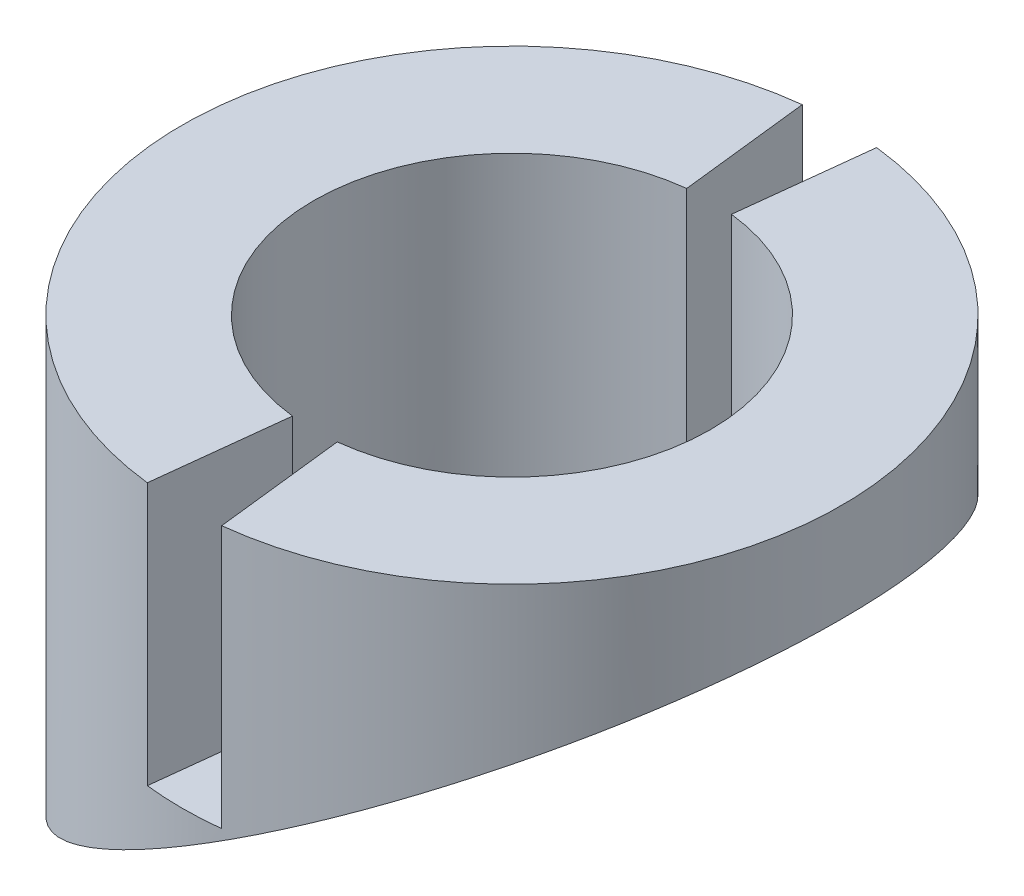
ISO-10303-21;
HEADER;
FILE_DESCRIPTION(('STEP AP214'),'2;1');
FILE_NAME('part.step','',(''),(''),'','','');
FILE_SCHEMA(('AUTOMOTIVE_DESIGN { 1 0 10303 214 1 1 1 1 }'));
ENDSEC;
DATA;
#1=APPLICATION_CONTEXT('core data for automotive mechanical design processes');
#2=APPLICATION_PROTOCOL_DEFINITION('international standard','automotive_design',2000,#1);
#3=PRODUCT_CONTEXT('',#1,'mechanical');
#4=PRODUCT('Part','Part','',(#3));
#5=PRODUCT_RELATED_PRODUCT_CATEGORY('part','',(#4));
#6=PRODUCT_DEFINITION_FORMATION('','',#4);
#7=PRODUCT_DEFINITION_CONTEXT('part definition',#1,'design');
#8=PRODUCT_DEFINITION('design','',#6,#7);
#9=PRODUCT_DEFINITION_SHAPE('','',#8);
#10=(LENGTH_UNIT() NAMED_UNIT(*) SI_UNIT(.MILLI.,.METRE.));
#11=(NAMED_UNIT(*) PLANE_ANGLE_UNIT() SI_UNIT($,.RADIAN.));
#12=(NAMED_UNIT(*) SI_UNIT($,.STERADIAN.) SOLID_ANGLE_UNIT());
#13=UNCERTAINTY_MEASURE_WITH_UNIT(LENGTH_MEASURE(1.E-05),#10,'distance_accuracy_value','');
#14=(GEOMETRIC_REPRESENTATION_CONTEXT(3) GLOBAL_UNCERTAINTY_ASSIGNED_CONTEXT((#13)) GLOBAL_UNIT_ASSIGNED_CONTEXT((#10,
#11,#12)) REPRESENTATION_CONTEXT('',''));
#15=CARTESIAN_POINT('',(0.,0.,0.));
#16=DIRECTION('',(0.,0.,1.));
#17=DIRECTION('',(1.,0.,0.));
#18=AXIS2_PLACEMENT_3D('',#15,#16,#17);
#19=CARTESIAN_POINT('',(0.,15.,0.));
#20=DIRECTION('',(0.,1.,0.));
#21=DIRECTION('',(0.,0.,1.));
#22=AXIS2_PLACEMENT_3D('',#19,#20,#21);
#23=PLANE('',#22);
#24=DIRECTION('',(0.112854640488553,0.,-0.99361150864923));
#25=VECTOR('',#24,1.);
#26=CARTESIAN_POINT('',(0.637272671467664,15.,-5.61077025966101));
#27=LINE('',#26,#25);
#28=CARTESIAN_POINT('',(0.682770574955748,15.,-6.01134962732784));
#29=VERTEX_POINT('',#28);
#30=CARTESIAN_POINT('',(1.13418913690996,15.,-9.98579566192476));
#31=VERTEX_POINT('',#30);
#32=EDGE_CURVE('E178',#29,#31,#27,.T.);
#33=ORIENTED_EDGE('',*,*,#32,.F.);
#34=CARTESIAN_POINT('',(0.,15.,0.));
#35=DIRECTION('',(0.,1.,0.));
#36=DIRECTION('',(0.,0.,1.));
#37=AXIS2_PLACEMENT_3D('',#34,#35,#36);
#38=CIRCLE('',#37,6.05);
#39=CARTESIAN_POINT('',(0.682770574955748,15.,6.01134962732784));
#40=VERTEX_POINT('',#39);
#41=EDGE_CURVE('E137',#40,#29,#38,.T.);
#42=ORIENTED_EDGE('',*,*,#41,.F.);
#43=DIRECTION('',(-0.112854640488553,0.,-0.99361150864923));
#44=VECTOR('',#43,1.);
#45=CARTESIAN_POINT('',(0.637272671467664,15.,5.61077025966101));
#46=LINE('',#45,#44);
#47=CARTESIAN_POINT('',(1.13418913690996,15.,9.98579566192476));
#48=VERTEX_POINT('',#47);
#49=EDGE_CURVE('E129',#48,#40,#46,.T.);
#50=ORIENTED_EDGE('',*,*,#49,.F.);
#51=CARTESIAN_POINT('',(0.,15.,0.));
#52=DIRECTION('',(0.,1.,0.));
#53=DIRECTION('',(0.,0.,1.));
#54=AXIS2_PLACEMENT_3D('',#51,#52,#53);
#55=CIRCLE('',#54,10.05);
#56=EDGE_CURVE('E148',#48,#31,#55,.T.);
#57=ORIENTED_EDGE('',*,*,#56,.T.);
#58=EDGE_LOOP('',(#33,#42,#50,#57));
#59=FACE_BOUND('',#58,.T.);
#60=ADVANCED_FACE('F40',(#59),#23,.T.);
#61=DIRECTION('',(0.112854640488553,0.,0.99361150864923));
#62=VECTOR('',#61,1.);
#63=CARTESIAN_POINT('',(-0.637272671467664,15.,-5.61077025966101));
#64=LINE('',#63,#62);
#65=CARTESIAN_POINT('',(-1.13418913690996,15.,-9.98579566192476));
#66=VERTEX_POINT('',#65);
#67=CARTESIAN_POINT('',(-0.682770574955748,15.,-6.01134962732784));
#68=VERTEX_POINT('',#67);
#69=EDGE_CURVE('E163',#66,#68,#64,.T.);
#70=ORIENTED_EDGE('',*,*,#69,.F.);
#71=CARTESIAN_POINT('',(-1.13418913690996,15.,9.98579566192476));
#72=VERTEX_POINT('',#71);
#73=EDGE_CURVE('E127',#66,#72,#55,.T.);
#74=ORIENTED_EDGE('',*,*,#73,.T.);
#75=DIRECTION('',(-0.112854640488553,0.,0.99361150864923));
#76=VECTOR('',#75,1.);
#77=CARTESIAN_POINT('',(-0.637272671467664,15.,5.61077025966101));
#78=LINE('',#77,#76);
#79=CARTESIAN_POINT('',(-0.682770574955748,15.,6.01134962732784));
#80=VERTEX_POINT('',#79);
#81=EDGE_CURVE('E109',#80,#72,#78,.T.);
#82=ORIENTED_EDGE('',*,*,#81,.F.);
#83=EDGE_CURVE('E125',#68,#80,#38,.T.);
#84=ORIENTED_EDGE('',*,*,#83,.F.);
#85=EDGE_LOOP('',(#70,#74,#82,#84));
#86=FACE_BOUND('',#85,.T.);
#87=ADVANCED_FACE('F124',(#86),#23,.T.);
#88=CARTESIAN_POINT('',(0.,15.,0.));
#89=DIRECTION('',(0.,-1.,0.));
#90=DIRECTION('',(0.,0.,-1.));
#91=AXIS2_PLACEMENT_3D('',#88,#89,#90);
#92=CYLINDRICAL_SURFACE('',#91,10.05);
#93=CARTESIAN_POINT('',(0.,7.,0.));
#94=DIRECTION('',(0.,1.,0.));
#95=DIRECTION('',(0.,0.,1.));
#96=AXIS2_PLACEMENT_3D('',#93,#94,#95);
#97=CIRCLE('',#96,10.05);
#98=CARTESIAN_POINT('',(1.13418913690996,7.,-9.98579566192476));
#99=VERTEX_POINT('',#98);
#100=CARTESIAN_POINT('',(-1.13418913690996,7.,-9.98579566192476));
#101=VERTEX_POINT('',#100);
#102=EDGE_CURVE('E200',#99,#101,#97,.T.);
#103=ORIENTED_EDGE('',*,*,#102,.F.);
#104=DIRECTION('',(0.,-1.,0.));
#105=VECTOR('',#104,1.);
#106=CARTESIAN_POINT('',(1.13418913690996,15.,-9.98579566192476));
#107=LINE('',#106,#105);
#108=EDGE_CURVE('E138',#99,#31,#107,.F.);
#109=ORIENTED_EDGE('',*,*,#108,.T.);
#110=ORIENTED_EDGE('',*,*,#56,.F.);
#111=DIRECTION('',(0.,-1.,0.));
#112=VECTOR('',#111,1.);
#113=CARTESIAN_POINT('',(1.13418913690996,15.,9.98579566192476));
#114=LINE('',#113,#112);
#115=CARTESIAN_POINT('',(1.13418913690996,7.,9.98579566192476));
#116=VERTEX_POINT('',#115);
#117=EDGE_CURVE('E196',#48,#116,#114,.T.);
#118=ORIENTED_EDGE('',*,*,#117,.T.);
#119=CARTESIAN_POINT('',(0.,7.,0.));
#120=DIRECTION('',(0.,-1.,0.));
#121=DIRECTION('',(0.,0.,-1.));
#122=AXIS2_PLACEMENT_3D('',#119,#120,#121);
#123=CIRCLE('',#122,10.05);
#124=CARTESIAN_POINT('',(-1.13418913690996,7.,9.98579566192476));
#125=VERTEX_POINT('',#124);
#126=EDGE_CURVE('E176',#116,#125,#123,.T.);
#127=ORIENTED_EDGE('',*,*,#126,.T.);
#128=DIRECTION('',(0.,-1.,0.));
#129=VECTOR('',#128,1.);
#130=CARTESIAN_POINT('',(-1.13418913690996,15.,9.98579566192476));
#131=LINE('',#130,#129);
#132=EDGE_CURVE('E193',#125,#72,#131,.F.);
#133=ORIENTED_EDGE('',*,*,#132,.T.);
#134=ORIENTED_EDGE('',*,*,#73,.F.);
#135=DIRECTION('',(0.,-1.,0.));
#136=VECTOR('',#135,1.);
#137=CARTESIAN_POINT('',(-1.13418913690996,15.,-9.98579566192476));
#138=LINE('',#137,#136);
#139=EDGE_CURVE('E144',#66,#101,#138,.T.);
#140=ORIENTED_EDGE('',*,*,#139,.T.);
#141=EDGE_LOOP('',(#103,#109,#110,#118,#127,#133,#134,#140));
#142=FACE_BOUND('',#141,.T.);
#143=CARTESIAN_POINT('',(0.,6.,0.));
#144=DIRECTION('',(-0.512609917553606,0.858621611902289,0.));
#145=DIRECTION('',(-0.858621611902289,-0.512609917553606,0.));
#146=AXIS2_PLACEMENT_3D('',#143,#144,#145);
#147=ELLIPSE('',#146,11.7048067049396,10.05);
#148=CARTESIAN_POINT('',(-10.05,0.,0.));
#149=VERTEX_POINT('',#148);
#150=EDGE_CURVE('E130',#149,#149,#147,.T.);
#151=ORIENTED_EDGE('',*,*,#150,.T.);
#152=EDGE_LOOP('',(#151));
#153=FACE_BOUND('',#152,.T.);
#154=ADVANCED_FACE('F42',(#142,#153),#92,.T.);
#155=CARTESIAN_POINT('',(0.,15.,0.));
#156=DIRECTION('',(0.,-1.,0.));
#157=DIRECTION('',(0.,0.,-1.));
#158=AXIS2_PLACEMENT_3D('',#155,#156,#157);
#159=CYLINDRICAL_SURFACE('',#158,6.05);
#160=CARTESIAN_POINT('',(0.,6.,0.));
#161=DIRECTION('',(-0.512609917553606,0.858621611902289,0.));
#162=DIRECTION('',(-0.858621611902289,-0.512609917553606,0.));
#163=AXIS2_PLACEMENT_3D('',#160,#161,#162);
#164=ELLIPSE('',#163,7.04617717063531,6.05);
#165=CARTESIAN_POINT('',(-6.05,2.38805970149254,0.));
#166=VERTEX_POINT('',#165);
#167=EDGE_CURVE('E44',#166,#166,#164,.T.);
#168=ORIENTED_EDGE('',*,*,#167,.F.);
#169=EDGE_LOOP('',(#168));
#170=FACE_BOUND('',#169,.T.);
#171=DIRECTION('',(0.,-1.,0.));
#172=VECTOR('',#171,1.);
#173=CARTESIAN_POINT('',(0.682770574955748,15.,-6.01134962732784));
#174=LINE('',#173,#172);
#175=CARTESIAN_POINT('',(0.682770574955748,7.,-6.01134962732784));
#176=VERTEX_POINT('',#175);
#177=EDGE_CURVE('E11',#176,#29,#174,.F.);
#178=ORIENTED_EDGE('',*,*,#177,.F.);
#179=CARTESIAN_POINT('',(0.,7.,0.));
#180=DIRECTION('',(0.,1.,0.));
#181=DIRECTION('',(0.,0.,1.));
#182=AXIS2_PLACEMENT_3D('',#179,#180,#181);
#183=CIRCLE('',#182,6.05);
#184=CARTESIAN_POINT('',(-0.682770574955748,7.,-6.01134962732784));
#185=VERTEX_POINT('',#184);
#186=EDGE_CURVE('E156',#176,#185,#183,.T.);
#187=ORIENTED_EDGE('',*,*,#186,.T.);
#188=DIRECTION('',(0.,-1.,0.));
#189=VECTOR('',#188,1.);
#190=CARTESIAN_POINT('',(-0.682770574955748,15.,-6.01134962732784));
#191=LINE('',#190,#189);
#192=EDGE_CURVE('E50',#68,#185,#191,.T.);
#193=ORIENTED_EDGE('',*,*,#192,.F.);
#194=ORIENTED_EDGE('',*,*,#83,.T.);
#195=DIRECTION('',(0.,-1.,0.));
#196=VECTOR('',#195,1.);
#197=CARTESIAN_POINT('',(-0.682770574955748,15.,6.01134962732784));
#198=LINE('',#197,#196);
#199=CARTESIAN_POINT('',(-0.682770574955748,7.,6.01134962732784));
#200=VERTEX_POINT('',#199);
#201=EDGE_CURVE('E106',#200,#80,#198,.F.);
#202=ORIENTED_EDGE('',*,*,#201,.F.);
#203=CARTESIAN_POINT('',(0.,7.,0.));
#204=DIRECTION('',(0.,-1.,0.));
#205=DIRECTION('',(0.,0.,-1.));
#206=AXIS2_PLACEMENT_3D('',#203,#204,#205);
#207=CIRCLE('',#206,6.05);
#208=CARTESIAN_POINT('',(0.682770574955748,7.,6.01134962732784));
#209=VERTEX_POINT('',#208);
#210=EDGE_CURVE('E118',#209,#200,#207,.T.);
#211=ORIENTED_EDGE('',*,*,#210,.F.);
#212=DIRECTION('',(0.,-1.,0.));
#213=VECTOR('',#212,1.);
#214=CARTESIAN_POINT('',(0.682770574955748,15.,6.01134962732784));
#215=LINE('',#214,#213);
#216=EDGE_CURVE('E117',#40,#209,#215,.T.);
#217=ORIENTED_EDGE('',*,*,#216,.F.);
#218=ORIENTED_EDGE('',*,*,#41,.T.);
#219=EDGE_LOOP('',(#178,#187,#193,#194,#202,#211,#217,#218));
#220=FACE_BOUND('',#219,.T.);
#221=ADVANCED_FACE('F134',(#170,#220),#159,.F.);
#222=CARTESIAN_POINT('',(0.637272671467664,7.,5.61077025966101));
#223=DIRECTION('',(0.99361150864923,0.,-0.112854640488553));
#224=DIRECTION('',(-0.112854640488553,0.,-0.99361150864923));
#225=AXIS2_PLACEMENT_3D('',#222,#223,#224);
#226=PLANE('',#225);
#227=ORIENTED_EDGE('',*,*,#49,.T.);
#228=ORIENTED_EDGE('',*,*,#216,.T.);
#229=DIRECTION('',(-0.112854640488553,0.,-0.99361150864923));
#230=VECTOR('',#229,1.);
#231=CARTESIAN_POINT('',(0.637272671467664,7.,5.61077025966101));
#232=LINE('',#231,#230);
#233=EDGE_CURVE('E65',#116,#209,#232,.T.);
#234=ORIENTED_EDGE('',*,*,#233,.F.);
#235=ORIENTED_EDGE('',*,*,#117,.F.);
#236=EDGE_LOOP('',(#227,#228,#234,#235));
#237=FACE_BOUND('',#236,.T.);
#238=ADVANCED_FACE('F213',(#237),#226,.F.);
#239=CARTESIAN_POINT('',(-0.637272671467664,7.,5.61077025966101));
#240=DIRECTION('',(-0.99361150864923,0.,-0.112854640488553));
#241=DIRECTION('',(-0.112854640488553,0.,0.99361150864923));
#242=AXIS2_PLACEMENT_3D('',#239,#240,#241);
#243=PLANE('',#242);
#244=DIRECTION('',(-0.112854640488553,0.,0.99361150864923));
#245=VECTOR('',#244,1.);
#246=CARTESIAN_POINT('',(-0.637272671467664,7.,5.61077025966101));
#247=LINE('',#246,#245);
#248=EDGE_CURVE('E112',#200,#125,#247,.T.);
#249=ORIENTED_EDGE('',*,*,#248,.F.);
#250=ORIENTED_EDGE('',*,*,#201,.T.);
#251=ORIENTED_EDGE('',*,*,#81,.T.);
#252=ORIENTED_EDGE('',*,*,#132,.F.);
#253=EDGE_LOOP('',(#249,#250,#251,#252));
#254=FACE_BOUND('',#253,.T.);
#255=ADVANCED_FACE('F108',(#254),#243,.F.);
#256=CARTESIAN_POINT('',(0.,7.,0.));
#257=DIRECTION('',(0.,-1.,0.));
#258=DIRECTION('',(0.,0.,-1.));
#259=AXIS2_PLACEMENT_3D('',#256,#257,#258);
#260=PLANE('',#259);
#261=ORIENTED_EDGE('',*,*,#233,.T.);
#262=ORIENTED_EDGE('',*,*,#210,.T.);
#263=ORIENTED_EDGE('',*,*,#248,.T.);
#264=ORIENTED_EDGE('',*,*,#126,.F.);
#265=EDGE_LOOP('',(#261,#262,#263,#264));
#266=FACE_BOUND('',#265,.T.);
#267=ADVANCED_FACE('F206',(#266),#260,.F.);
#268=CARTESIAN_POINT('',(0.637272671467664,7.,-5.61077025966101));
#269=DIRECTION('',(0.99361150864923,0.,0.112854640488553));
#270=DIRECTION('',(0.112854640488553,0.,-0.99361150864923));
#271=AXIS2_PLACEMENT_3D('',#268,#269,#270);
#272=PLANE('',#271);
#273=DIRECTION('',(0.112854640488553,0.,-0.99361150864923));
#274=VECTOR('',#273,1.);
#275=CARTESIAN_POINT('',(0.637272671467664,7.,-5.61077025966101));
#276=LINE('',#275,#274);
#277=EDGE_CURVE('E167',#176,#99,#276,.T.);
#278=ORIENTED_EDGE('',*,*,#277,.F.);
#279=ORIENTED_EDGE('',*,*,#177,.T.);
#280=ORIENTED_EDGE('',*,*,#32,.T.);
#281=ORIENTED_EDGE('',*,*,#108,.F.);
#282=EDGE_LOOP('',(#278,#279,#280,#281));
#283=FACE_BOUND('',#282,.T.);
#284=ADVANCED_FACE('F170',(#283),#272,.F.);
#285=CARTESIAN_POINT('',(-0.637272671467664,7.,-5.61077025966101));
#286=DIRECTION('',(-0.99361150864923,0.,0.112854640488553));
#287=DIRECTION('',(0.112854640488553,0.,0.99361150864923));
#288=AXIS2_PLACEMENT_3D('',#285,#286,#287);
#289=PLANE('',#288);
#290=ORIENTED_EDGE('',*,*,#69,.T.);
#291=ORIENTED_EDGE('',*,*,#192,.T.);
#292=DIRECTION('',(0.112854640488553,0.,0.99361150864923));
#293=VECTOR('',#292,1.);
#294=CARTESIAN_POINT('',(-0.637272671467664,7.,-5.61077025966101));
#295=LINE('',#294,#293);
#296=EDGE_CURVE('E57',#101,#185,#295,.T.);
#297=ORIENTED_EDGE('',*,*,#296,.F.);
#298=ORIENTED_EDGE('',*,*,#139,.F.);
#299=EDGE_LOOP('',(#290,#291,#297,#298));
#300=FACE_BOUND('',#299,.T.);
#301=ADVANCED_FACE('F161',(#300),#289,.F.);
#302=CARTESIAN_POINT('',(0.,7.,0.));
#303=DIRECTION('',(0.,1.,0.));
#304=DIRECTION('',(0.,0.,1.));
#305=AXIS2_PLACEMENT_3D('',#302,#303,#304);
#306=PLANE('',#305);
#307=ORIENTED_EDGE('',*,*,#102,.T.);
#308=ORIENTED_EDGE('',*,*,#296,.T.);
#309=ORIENTED_EDGE('',*,*,#186,.F.);
#310=ORIENTED_EDGE('',*,*,#277,.T.);
#311=EDGE_LOOP('',(#307,#308,#309,#310));
#312=FACE_BOUND('',#311,.T.);
#313=ADVANCED_FACE('F166',(#312),#306,.T.);
#314=CARTESIAN_POINT('',(-10.05,0.,-15.));
#315=DIRECTION('',(-0.512609917553606,0.858621611902289,0.));
#316=DIRECTION('',(-0.858621611902289,-0.512609917553606,0.));
#317=AXIS2_PLACEMENT_3D('',#314,#315,#316);
#318=PLANE('',#317);
#319=ORIENTED_EDGE('',*,*,#167,.T.);
#320=EDGE_LOOP('',(#319));
#321=FACE_BOUND('',#320,.T.);
#322=ORIENTED_EDGE('',*,*,#150,.F.);
#323=EDGE_LOOP('',(#322));
#324=FACE_BOUND('',#323,.T.);
#325=ADVANCED_FACE('F245',(#321,#324),#318,.F.);
#326=CLOSED_SHELL('',(#60,#87,#154,#221,#238,#255,#267,#284,#301,#313,#325));
#327=MANIFOLD_SOLID_BREP('B2',#326);
#328=ADVANCED_BREP_SHAPE_REPRESENTATION('',(#18,#327),#14);
#329=SHAPE_DEFINITION_REPRESENTATION(#9,#328);
ENDSEC;
END-ISO-10303-21;
